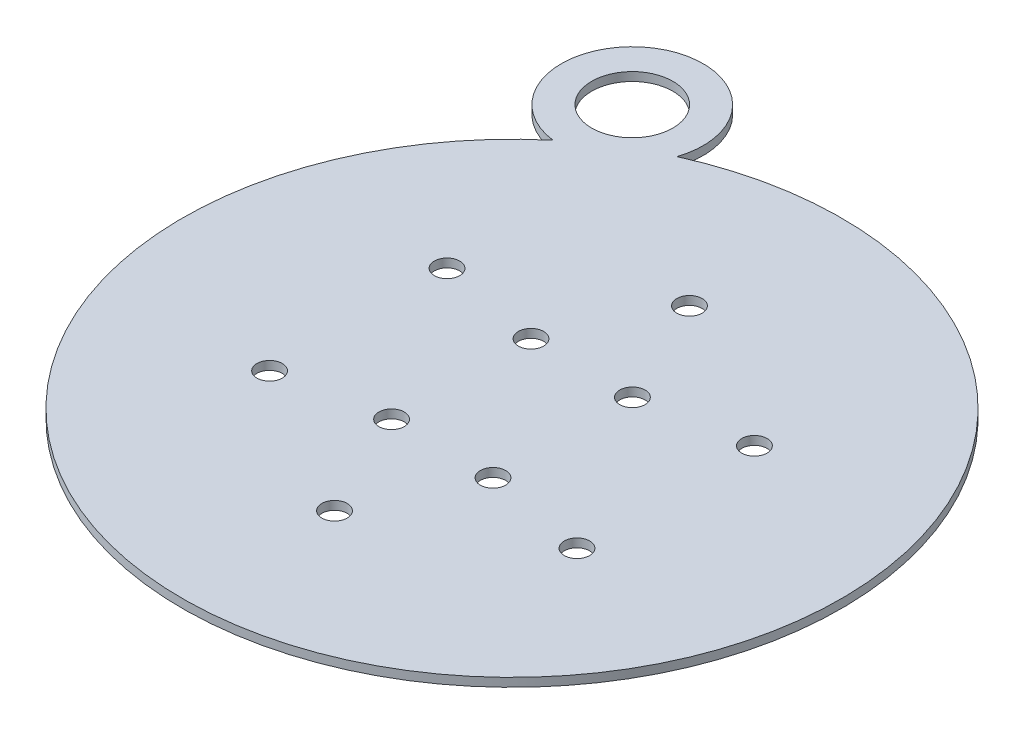
ISO-10303-21;
HEADER;
FILE_DESCRIPTION(('STEP AP214'),'2;1');
FILE_NAME('part.step','',(''),(''),'','','');
FILE_SCHEMA(('AUTOMOTIVE_DESIGN { 1 0 10303 214 1 1 1 1 }'));
ENDSEC;
DATA;
#1=APPLICATION_CONTEXT('core data for automotive mechanical design processes');
#2=APPLICATION_PROTOCOL_DEFINITION('international standard','automotive_design',2000,#1);
#3=PRODUCT_CONTEXT('',#1,'mechanical');
#4=PRODUCT('Part','Part','',(#3));
#5=PRODUCT_RELATED_PRODUCT_CATEGORY('part','',(#4));
#6=PRODUCT_DEFINITION_FORMATION('','',#4);
#7=PRODUCT_DEFINITION_CONTEXT('part definition',#1,'design');
#8=PRODUCT_DEFINITION('design','',#6,#7);
#9=PRODUCT_DEFINITION_SHAPE('','',#8);
#10=(LENGTH_UNIT() NAMED_UNIT(*) SI_UNIT(.MILLI.,.METRE.));
#11=(NAMED_UNIT(*) PLANE_ANGLE_UNIT() SI_UNIT($,.RADIAN.));
#12=(NAMED_UNIT(*) SI_UNIT($,.STERADIAN.) SOLID_ANGLE_UNIT());
#13=UNCERTAINTY_MEASURE_WITH_UNIT(LENGTH_MEASURE(1.E-05),#10,'distance_accuracy_value','');
#14=(GEOMETRIC_REPRESENTATION_CONTEXT(3) GLOBAL_UNCERTAINTY_ASSIGNED_CONTEXT((#13)) GLOBAL_UNIT_ASSIGNED_CONTEXT((#10,
#11,#12)) REPRESENTATION_CONTEXT('',''));
#15=CARTESIAN_POINT('',(0.,0.,0.));
#16=DIRECTION('',(0.,0.,1.));
#17=DIRECTION('',(1.,0.,0.));
#18=AXIS2_PLACEMENT_3D('',#15,#16,#17);
#19=CARTESIAN_POINT('',(0.,1.7,0.));
#20=DIRECTION('',(0.,-1.,0.));
#21=DIRECTION('',(0.,0.,-1.));
#22=AXIS2_PLACEMENT_3D('',#19,#20,#21);
#23=CYLINDRICAL_SURFACE('',#22,65.);
#24=CARTESIAN_POINT('',(0.,0.,0.));
#25=DIRECTION('',(0.,1.,0.));
#26=DIRECTION('',(0.,0.,1.));
#27=AXIS2_PLACEMENT_3D('',#24,#25,#26);
#28=CIRCLE('',#27,65.);
#29=CARTESIAN_POINT('',(-41.7401975185518,0.,-49.8272607225431));
#30=VERTEX_POINT('',#29);
#31=CARTESIAN_POINT('',(-26.7329434391451,0.,-59.248204488233));
#32=VERTEX_POINT('',#31);
#33=EDGE_CURVE('E65',#30,#32,#28,.T.);
#34=ORIENTED_EDGE('',*,*,#33,.T.);
#35=DIRECTION('',(0.,-1.,0.));
#36=VECTOR('',#35,1.);
#37=CARTESIAN_POINT('',(-26.7329434391451,1.7,-59.248204488233));
#38=LINE('',#37,#36);
#39=CARTESIAN_POINT('',(-26.7329434391451,1.7,-59.248204488233));
#40=VERTEX_POINT('',#39);
#41=EDGE_CURVE('E11',#40,#32,#38,.T.);
#42=ORIENTED_EDGE('',*,*,#41,.F.);
#43=CARTESIAN_POINT('',(0.,1.7,0.));
#44=DIRECTION('',(0.,1.,0.));
#45=DIRECTION('',(0.,0.,1.));
#46=AXIS2_PLACEMENT_3D('',#43,#44,#45);
#47=CIRCLE('',#46,65.);
#48=CARTESIAN_POINT('',(-41.7401975185518,1.7,-49.8272607225431));
#49=VERTEX_POINT('',#48);
#50=EDGE_CURVE('E68',#49,#40,#47,.T.);
#51=ORIENTED_EDGE('',*,*,#50,.F.);
#52=DIRECTION('',(0.,-1.,0.));
#53=VECTOR('',#52,1.);
#54=CARTESIAN_POINT('',(-41.7401975185518,1.7,-49.8272607225431));
#55=LINE('',#54,#53);
#56=EDGE_CURVE('E42',#49,#30,#55,.T.);
#57=ORIENTED_EDGE('',*,*,#56,.T.);
#58=EDGE_LOOP('',(#34,#42,#51,#57));
#59=FACE_BOUND('',#58,.T.);
#60=ADVANCED_FACE('F33',(#59),#23,.T.);
#61=CARTESIAN_POINT('',(-30.3108891324554,1.7,17.4999999999993));
#62=DIRECTION('',(0.,-1.,0.));
#63=DIRECTION('',(0.,0.,-1.));
#64=AXIS2_PLACEMENT_3D('',#61,#62,#63);
#65=CYLINDRICAL_SURFACE('',#64,2.49999999999982);
#66=CARTESIAN_POINT('',(-30.3108891324554,1.7,17.4999999999993));
#67=DIRECTION('',(0.,1.,0.));
#68=DIRECTION('',(0.,0.,1.));
#69=AXIS2_PLACEMENT_3D('',#66,#67,#68);
#70=CIRCLE('',#69,2.49999999999982);
#71=CARTESIAN_POINT('',(-30.3108891324554,1.7,19.9999999999991));
#72=VERTEX_POINT('',#71);
#73=EDGE_CURVE('E117',#72,#72,#70,.T.);
#74=ORIENTED_EDGE('',*,*,#73,.T.);
#75=EDGE_LOOP('',(#74));
#76=FACE_BOUND('',#75,.T.);
#77=CARTESIAN_POINT('',(-30.3108891324554,0.,17.4999999999993));
#78=DIRECTION('',(0.,1.,0.));
#79=DIRECTION('',(0.,0.,1.));
#80=AXIS2_PLACEMENT_3D('',#77,#78,#79);
#81=CIRCLE('',#80,2.49999999999982);
#82=CARTESIAN_POINT('',(-30.3108891324554,0.,19.9999999999991));
#83=VERTEX_POINT('',#82);
#84=EDGE_CURVE('E64',#83,#83,#81,.T.);
#85=ORIENTED_EDGE('',*,*,#84,.F.);
#86=EDGE_LOOP('',(#85));
#87=FACE_BOUND('',#86,.T.);
#88=ADVANCED_FACE('F163',(#76,#87),#65,.F.);
#89=CARTESIAN_POINT('',(-40.,1.7,-63.7186865887537));
#90=DIRECTION('',(0.,-1.,0.));
#91=DIRECTION('',(0.,0.,-1.));
#92=AXIS2_PLACEMENT_3D('',#89,#90,#91);
#93=CYLINDRICAL_SURFACE('',#92,14.);
#94=CARTESIAN_POINT('',(-40.,0.,-63.7186865887537));
#95=DIRECTION('',(0.,1.,0.));
#96=DIRECTION('',(0.,0.,1.));
#97=AXIS2_PLACEMENT_3D('',#94,#95,#96);
#98=CIRCLE('',#97,14.);
#99=EDGE_CURVE('E57',#32,#30,#98,.T.);
#100=ORIENTED_EDGE('',*,*,#99,.T.);
#101=ORIENTED_EDGE('',*,*,#56,.F.);
#102=CARTESIAN_POINT('',(-40.,1.7,-63.7186865887537));
#103=DIRECTION('',(0.,1.,0.));
#104=DIRECTION('',(0.,0.,1.));
#105=AXIS2_PLACEMENT_3D('',#102,#103,#104);
#106=CIRCLE('',#105,14.);
#107=EDGE_CURVE('E49',#40,#49,#106,.T.);
#108=ORIENTED_EDGE('',*,*,#107,.F.);
#109=ORIENTED_EDGE('',*,*,#41,.T.);
#110=EDGE_LOOP('',(#100,#101,#108,#109));
#111=FACE_BOUND('',#110,.T.);
#112=ADVANCED_FACE('F60',(#111),#93,.T.);
#113=CARTESIAN_POINT('',(-40.,1.7,-63.7186865887537));
#114=DIRECTION('',(0.,-1.,0.));
#115=DIRECTION('',(0.,0.,-1.));
#116=AXIS2_PLACEMENT_3D('',#113,#114,#115);
#117=CYLINDRICAL_SURFACE('',#116,8.);
#118=CARTESIAN_POINT('',(-40.,1.7,-63.7186865887537));
#119=DIRECTION('',(0.,1.,0.));
#120=DIRECTION('',(0.,0.,1.));
#121=AXIS2_PLACEMENT_3D('',#118,#119,#120);
#122=CIRCLE('',#121,8.);
#123=CARTESIAN_POINT('',(-40.,1.7,-55.7186865887537));
#124=VERTEX_POINT('',#123);
#125=EDGE_CURVE('E112',#124,#124,#122,.T.);
#126=ORIENTED_EDGE('',*,*,#125,.T.);
#127=EDGE_LOOP('',(#126));
#128=FACE_BOUND('',#127,.T.);
#129=CARTESIAN_POINT('',(-40.,0.,-63.7186865887537));
#130=DIRECTION('',(0.,1.,0.));
#131=DIRECTION('',(0.,0.,1.));
#132=AXIS2_PLACEMENT_3D('',#129,#130,#131);
#133=CIRCLE('',#132,8.);
#134=CARTESIAN_POINT('',(-40.,0.,-55.7186865887537));
#135=VERTEX_POINT('',#134);
#136=EDGE_CURVE('E72',#135,#135,#133,.T.);
#137=ORIENTED_EDGE('',*,*,#136,.F.);
#138=EDGE_LOOP('',(#137));
#139=FACE_BOUND('',#138,.T.);
#140=ADVANCED_FACE('F150',(#128,#139),#117,.F.);
#141=CARTESIAN_POINT('',(-4.26593399068118E-13,1.7,34.9999999999993));
#142=DIRECTION('',(0.,-1.,0.));
#143=DIRECTION('',(0.,0.,-1.));
#144=AXIS2_PLACEMENT_3D('',#141,#142,#143);
#145=CYLINDRICAL_SURFACE('',#144,2.50000000000004);
#146=CARTESIAN_POINT('',(-4.26593399068118E-13,1.7,34.9999999999993));
#147=DIRECTION('',(0.,1.,0.));
#148=DIRECTION('',(0.,0.,1.));
#149=AXIS2_PLACEMENT_3D('',#146,#147,#148);
#150=CIRCLE('',#149,2.50000000000004);
#151=CARTESIAN_POINT('',(-4.26593399068118E-13,1.7,37.4999999999993));
#152=VERTEX_POINT('',#151);
#153=EDGE_CURVE('E109',#152,#152,#150,.T.);
#154=ORIENTED_EDGE('',*,*,#153,.T.);
#155=EDGE_LOOP('',(#154));
#156=FACE_BOUND('',#155,.T.);
#157=CARTESIAN_POINT('',(-4.26593399068118E-13,0.,34.9999999999993));
#158=DIRECTION('',(0.,1.,0.));
#159=DIRECTION('',(0.,0.,1.));
#160=AXIS2_PLACEMENT_3D('',#157,#158,#159);
#161=CIRCLE('',#160,2.50000000000004);
#162=CARTESIAN_POINT('',(-4.26593399068118E-13,0.,37.4999999999993));
#163=VERTEX_POINT('',#162);
#164=EDGE_CURVE('E75',#163,#163,#161,.T.);
#165=ORIENTED_EDGE('',*,*,#164,.F.);
#166=EDGE_LOOP('',(#165));
#167=FACE_BOUND('',#166,.T.);
#168=ADVANCED_FACE('F147',(#156,#167),#145,.F.);
#169=CARTESIAN_POINT('',(30.3108891324547,1.7,17.4999999999996));
#170=DIRECTION('',(0.,-1.,0.));
#171=DIRECTION('',(0.,0.,-1.));
#172=AXIS2_PLACEMENT_3D('',#169,#170,#171);
#173=CYLINDRICAL_SURFACE('',#172,2.50000000000037);
#174=CARTESIAN_POINT('',(30.3108891324547,1.7,17.4999999999996));
#175=DIRECTION('',(0.,1.,0.));
#176=DIRECTION('',(0.,0.,1.));
#177=AXIS2_PLACEMENT_3D('',#174,#175,#176);
#178=CIRCLE('',#177,2.50000000000037);
#179=CARTESIAN_POINT('',(30.3108891324547,1.7,20.));
#180=VERTEX_POINT('',#179);
#181=EDGE_CURVE('E106',#180,#180,#178,.T.);
#182=ORIENTED_EDGE('',*,*,#181,.T.);
#183=EDGE_LOOP('',(#182));
#184=FACE_BOUND('',#183,.T.);
#185=CARTESIAN_POINT('',(30.3108891324547,0.,17.4999999999996));
#186=DIRECTION('',(0.,1.,0.));
#187=DIRECTION('',(0.,0.,1.));
#188=AXIS2_PLACEMENT_3D('',#185,#186,#187);
#189=CIRCLE('',#188,2.50000000000037);
#190=CARTESIAN_POINT('',(30.3108891324547,0.,20.));
#191=VERTEX_POINT('',#190);
#192=EDGE_CURVE('E140',#191,#191,#189,.T.);
#193=ORIENTED_EDGE('',*,*,#192,.F.);
#194=EDGE_LOOP('',(#193));
#195=FACE_BOUND('',#194,.T.);
#196=ADVANCED_FACE('F149',(#184,#195),#173,.F.);
#197=CARTESIAN_POINT('',(30.3108891324554,1.7,-17.4999999999999));
#198=DIRECTION('',(0.,-1.,0.));
#199=DIRECTION('',(0.,0.,-1.));
#200=AXIS2_PLACEMENT_3D('',#197,#198,#199);
#201=CYLINDRICAL_SURFACE('',#200,2.5);
#202=CARTESIAN_POINT('',(30.3108891324554,1.7,-17.4999999999999));
#203=DIRECTION('',(0.,1.,0.));
#204=DIRECTION('',(0.,0.,1.));
#205=AXIS2_PLACEMENT_3D('',#202,#203,#204);
#206=CIRCLE('',#205,2.5);
#207=CARTESIAN_POINT('',(30.3108891324554,1.7,-14.9999999999999));
#208=VERTEX_POINT('',#207);
#209=EDGE_CURVE('E103',#208,#208,#206,.T.);
#210=ORIENTED_EDGE('',*,*,#209,.T.);
#211=EDGE_LOOP('',(#210));
#212=FACE_BOUND('',#211,.T.);
#213=CARTESIAN_POINT('',(30.3108891324554,0.,-17.4999999999999));
#214=DIRECTION('',(0.,1.,0.));
#215=DIRECTION('',(0.,0.,1.));
#216=AXIS2_PLACEMENT_3D('',#213,#214,#215);
#217=CIRCLE('',#216,2.5);
#218=CARTESIAN_POINT('',(30.3108891324554,0.,-14.9999999999999));
#219=VERTEX_POINT('',#218);
#220=EDGE_CURVE('E137',#219,#219,#217,.T.);
#221=ORIENTED_EDGE('',*,*,#220,.F.);
#222=EDGE_LOOP('',(#221));
#223=FACE_BOUND('',#222,.T.);
#224=ADVANCED_FACE('F157',(#212,#223),#201,.F.);
#225=CARTESIAN_POINT('',(0.,1.7,-35.));
#226=DIRECTION('',(0.,-1.,0.));
#227=DIRECTION('',(0.,0.,-1.));
#228=AXIS2_PLACEMENT_3D('',#225,#226,#227);
#229=CYLINDRICAL_SURFACE('',#228,2.5);
#230=CARTESIAN_POINT('',(0.,1.7,-35.));
#231=DIRECTION('',(0.,1.,0.));
#232=DIRECTION('',(0.,0.,1.));
#233=AXIS2_PLACEMENT_3D('',#230,#231,#232);
#234=CIRCLE('',#233,2.5);
#235=CARTESIAN_POINT('',(0.,1.7,-32.5));
#236=VERTEX_POINT('',#235);
#237=EDGE_CURVE('E100',#236,#236,#234,.T.);
#238=ORIENTED_EDGE('',*,*,#237,.T.);
#239=EDGE_LOOP('',(#238));
#240=FACE_BOUND('',#239,.T.);
#241=CARTESIAN_POINT('',(0.,0.,-35.));
#242=DIRECTION('',(0.,1.,0.));
#243=DIRECTION('',(0.,0.,1.));
#244=AXIS2_PLACEMENT_3D('',#241,#242,#243);
#245=CIRCLE('',#244,2.5);
#246=CARTESIAN_POINT('',(0.,0.,-32.5));
#247=VERTEX_POINT('',#246);
#248=EDGE_CURVE('E134',#247,#247,#245,.T.);
#249=ORIENTED_EDGE('',*,*,#248,.F.);
#250=EDGE_LOOP('',(#249));
#251=FACE_BOUND('',#250,.T.);
#252=ADVANCED_FACE('F216',(#240,#251),#229,.F.);
#253=CARTESIAN_POINT('',(-30.3108891324552,1.7,-17.5000000000004));
#254=DIRECTION('',(0.,-1.,0.));
#255=DIRECTION('',(0.,0.,-1.));
#256=AXIS2_PLACEMENT_3D('',#253,#254,#255);
#257=CYLINDRICAL_SURFACE('',#256,2.5);
#258=CARTESIAN_POINT('',(-30.3108891324552,1.7,-17.5000000000004));
#259=DIRECTION('',(0.,1.,0.));
#260=DIRECTION('',(0.,0.,1.));
#261=AXIS2_PLACEMENT_3D('',#258,#259,#260);
#262=CIRCLE('',#261,2.5);
#263=CARTESIAN_POINT('',(-30.3108891324552,1.7,-15.0000000000004));
#264=VERTEX_POINT('',#263);
#265=EDGE_CURVE('E97',#264,#264,#262,.T.);
#266=ORIENTED_EDGE('',*,*,#265,.T.);
#267=EDGE_LOOP('',(#266));
#268=FACE_BOUND('',#267,.T.);
#269=CARTESIAN_POINT('',(-30.3108891324552,0.,-17.5000000000004));
#270=DIRECTION('',(0.,1.,0.));
#271=DIRECTION('',(0.,0.,1.));
#272=AXIS2_PLACEMENT_3D('',#269,#270,#271);
#273=CIRCLE('',#272,2.5);
#274=CARTESIAN_POINT('',(-30.3108891324552,0.,-15.0000000000004));
#275=VERTEX_POINT('',#274);
#276=EDGE_CURVE('E131',#275,#275,#273,.T.);
#277=ORIENTED_EDGE('',*,*,#276,.F.);
#278=EDGE_LOOP('',(#277));
#279=FACE_BOUND('',#278,.T.);
#280=ADVANCED_FACE('F223',(#268,#279),#257,.F.);
#281=CARTESIAN_POINT('',(10.,1.7,13.75));
#282=DIRECTION('',(0.,-1.,0.));
#283=DIRECTION('',(0.,0.,-1.));
#284=AXIS2_PLACEMENT_3D('',#281,#282,#283);
#285=CYLINDRICAL_SURFACE('',#284,2.5);
#286=CARTESIAN_POINT('',(10.,1.7,13.75));
#287=DIRECTION('',(0.,1.,0.));
#288=DIRECTION('',(0.,0.,1.));
#289=AXIS2_PLACEMENT_3D('',#286,#287,#288);
#290=CIRCLE('',#289,2.5);
#291=CARTESIAN_POINT('',(10.,1.7,16.25));
#292=VERTEX_POINT('',#291);
#293=EDGE_CURVE('E92',#292,#292,#290,.T.);
#294=ORIENTED_EDGE('',*,*,#293,.T.);
#295=EDGE_LOOP('',(#294));
#296=FACE_BOUND('',#295,.T.);
#297=CARTESIAN_POINT('',(10.,0.,13.75));
#298=DIRECTION('',(0.,1.,0.));
#299=DIRECTION('',(0.,0.,1.));
#300=AXIS2_PLACEMENT_3D('',#297,#298,#299);
#301=CIRCLE('',#300,2.5);
#302=CARTESIAN_POINT('',(10.,0.,16.25));
#303=VERTEX_POINT('',#302);
#304=EDGE_CURVE('E128',#303,#303,#301,.T.);
#305=ORIENTED_EDGE('',*,*,#304,.F.);
#306=EDGE_LOOP('',(#305));
#307=FACE_BOUND('',#306,.T.);
#308=ADVANCED_FACE('F229',(#296,#307),#285,.F.);
#309=CARTESIAN_POINT('',(10.,1.7,-13.75));
#310=DIRECTION('',(0.,-1.,0.));
#311=DIRECTION('',(0.,0.,-1.));
#312=AXIS2_PLACEMENT_3D('',#309,#310,#311);
#313=CYLINDRICAL_SURFACE('',#312,2.5);
#314=CARTESIAN_POINT('',(10.,1.7,-13.75));
#315=DIRECTION('',(0.,1.,0.));
#316=DIRECTION('',(0.,0.,1.));
#317=AXIS2_PLACEMENT_3D('',#314,#315,#316);
#318=CIRCLE('',#317,2.5);
#319=CARTESIAN_POINT('',(10.,1.7,-11.25));
#320=VERTEX_POINT('',#319);
#321=EDGE_CURVE('E87',#320,#320,#318,.T.);
#322=ORIENTED_EDGE('',*,*,#321,.T.);
#323=EDGE_LOOP('',(#322));
#324=FACE_BOUND('',#323,.T.);
#325=CARTESIAN_POINT('',(10.,0.,-13.75));
#326=DIRECTION('',(0.,1.,0.));
#327=DIRECTION('',(0.,0.,1.));
#328=AXIS2_PLACEMENT_3D('',#325,#326,#327);
#329=CIRCLE('',#328,2.5);
#330=CARTESIAN_POINT('',(10.,0.,-11.25));
#331=VERTEX_POINT('',#330);
#332=EDGE_CURVE('E125',#331,#331,#329,.T.);
#333=ORIENTED_EDGE('',*,*,#332,.F.);
#334=EDGE_LOOP('',(#333));
#335=FACE_BOUND('',#334,.T.);
#336=ADVANCED_FACE('F232',(#324,#335),#313,.F.);
#337=CARTESIAN_POINT('',(-10.,1.7,13.75));
#338=DIRECTION('',(0.,-1.,0.));
#339=DIRECTION('',(0.,0.,-1.));
#340=AXIS2_PLACEMENT_3D('',#337,#338,#339);
#341=CYLINDRICAL_SURFACE('',#340,2.5);
#342=CARTESIAN_POINT('',(-10.,1.7,13.75));
#343=DIRECTION('',(0.,1.,0.));
#344=DIRECTION('',(0.,0.,1.));
#345=AXIS2_PLACEMENT_3D('',#342,#343,#344);
#346=CIRCLE('',#345,2.5);
#347=CARTESIAN_POINT('',(-10.,1.7,16.25));
#348=VERTEX_POINT('',#347);
#349=EDGE_CURVE('E83',#348,#348,#346,.T.);
#350=ORIENTED_EDGE('',*,*,#349,.T.);
#351=EDGE_LOOP('',(#350));
#352=FACE_BOUND('',#351,.T.);
#353=CARTESIAN_POINT('',(-10.,0.,13.75));
#354=DIRECTION('',(0.,1.,0.));
#355=DIRECTION('',(0.,0.,1.));
#356=AXIS2_PLACEMENT_3D('',#353,#354,#355);
#357=CIRCLE('',#356,2.5);
#358=CARTESIAN_POINT('',(-10.,0.,16.25));
#359=VERTEX_POINT('',#358);
#360=EDGE_CURVE('E122',#359,#359,#357,.T.);
#361=ORIENTED_EDGE('',*,*,#360,.F.);
#362=EDGE_LOOP('',(#361));
#363=FACE_BOUND('',#362,.T.);
#364=ADVANCED_FACE('F35',(#352,#363),#341,.F.);
#365=CARTESIAN_POINT('',(-10.,1.7,-13.75));
#366=DIRECTION('',(0.,-1.,0.));
#367=DIRECTION('',(0.,0.,-1.));
#368=AXIS2_PLACEMENT_3D('',#365,#366,#367);
#369=CYLINDRICAL_SURFACE('',#368,2.5);
#370=CARTESIAN_POINT('',(-10.,1.7,-13.75));
#371=DIRECTION('',(0.,1.,0.));
#372=DIRECTION('',(0.,0.,1.));
#373=AXIS2_PLACEMENT_3D('',#370,#371,#372);
#374=CIRCLE('',#373,2.5);
#375=CARTESIAN_POINT('',(-10.,1.7,-11.25));
#376=VERTEX_POINT('',#375);
#377=EDGE_CURVE('E69',#376,#376,#374,.T.);
#378=ORIENTED_EDGE('',*,*,#377,.T.);
#379=EDGE_LOOP('',(#378));
#380=FACE_BOUND('',#379,.T.);
#381=CARTESIAN_POINT('',(-10.,0.,-13.75));
#382=DIRECTION('',(0.,1.,0.));
#383=DIRECTION('',(0.,0.,1.));
#384=AXIS2_PLACEMENT_3D('',#381,#382,#383);
#385=CIRCLE('',#384,2.5);
#386=CARTESIAN_POINT('',(-10.,0.,-11.25));
#387=VERTEX_POINT('',#386);
#388=EDGE_CURVE('E81',#387,#387,#385,.T.);
#389=ORIENTED_EDGE('',*,*,#388,.F.);
#390=EDGE_LOOP('',(#389));
#391=FACE_BOUND('',#390,.T.);
#392=ADVANCED_FACE('F173',(#380,#391),#369,.F.);
#393=CARTESIAN_POINT('',(0.,1.7,0.));
#394=DIRECTION('',(0.,1.,0.));
#395=DIRECTION('',(0.,0.,1.));
#396=AXIS2_PLACEMENT_3D('',#393,#394,#395);
#397=PLANE('',#396);
#398=ORIENTED_EDGE('',*,*,#349,.F.);
#399=EDGE_LOOP('',(#398));
#400=FACE_BOUND('',#399,.T.);
#401=ORIENTED_EDGE('',*,*,#321,.F.);
#402=EDGE_LOOP('',(#401));
#403=FACE_BOUND('',#402,.T.);
#404=ORIENTED_EDGE('',*,*,#293,.F.);
#405=EDGE_LOOP('',(#404));
#406=FACE_BOUND('',#405,.T.);
#407=ORIENTED_EDGE('',*,*,#265,.F.);
#408=EDGE_LOOP('',(#407));
#409=FACE_BOUND('',#408,.T.);
#410=ORIENTED_EDGE('',*,*,#237,.F.);
#411=EDGE_LOOP('',(#410));
#412=FACE_BOUND('',#411,.T.);
#413=ORIENTED_EDGE('',*,*,#209,.F.);
#414=EDGE_LOOP('',(#413));
#415=FACE_BOUND('',#414,.T.);
#416=ORIENTED_EDGE('',*,*,#181,.F.);
#417=EDGE_LOOP('',(#416));
#418=FACE_BOUND('',#417,.T.);
#419=ORIENTED_EDGE('',*,*,#153,.F.);
#420=EDGE_LOOP('',(#419));
#421=FACE_BOUND('',#420,.T.);
#422=ORIENTED_EDGE('',*,*,#125,.F.);
#423=EDGE_LOOP('',(#422));
#424=FACE_BOUND('',#423,.T.);
#425=ORIENTED_EDGE('',*,*,#50,.T.);
#426=ORIENTED_EDGE('',*,*,#107,.T.);
#427=EDGE_LOOP('',(#425,#426));
#428=FACE_BOUND('',#427,.T.);
#429=ORIENTED_EDGE('',*,*,#73,.F.);
#430=EDGE_LOOP('',(#429));
#431=FACE_BOUND('',#430,.T.);
#432=ORIENTED_EDGE('',*,*,#377,.F.);
#433=EDGE_LOOP('',(#432));
#434=FACE_BOUND('',#433,.T.);
#435=ADVANCED_FACE('F176',(#400,#403,#406,#409,#412,#415,#418,#421,#424,#428,#431,#434),#397,.T.);
#436=CARTESIAN_POINT('',(0.,0.,0.));
#437=DIRECTION('',(0.,1.,0.));
#438=DIRECTION('',(0.,0.,1.));
#439=AXIS2_PLACEMENT_3D('',#436,#437,#438);
#440=PLANE('',#439);
#441=ORIENTED_EDGE('',*,*,#360,.T.);
#442=EDGE_LOOP('',(#441));
#443=FACE_BOUND('',#442,.T.);
#444=ORIENTED_EDGE('',*,*,#332,.T.);
#445=EDGE_LOOP('',(#444));
#446=FACE_BOUND('',#445,.T.);
#447=ORIENTED_EDGE('',*,*,#304,.T.);
#448=EDGE_LOOP('',(#447));
#449=FACE_BOUND('',#448,.T.);
#450=ORIENTED_EDGE('',*,*,#276,.T.);
#451=EDGE_LOOP('',(#450));
#452=FACE_BOUND('',#451,.T.);
#453=ORIENTED_EDGE('',*,*,#248,.T.);
#454=EDGE_LOOP('',(#453));
#455=FACE_BOUND('',#454,.T.);
#456=ORIENTED_EDGE('',*,*,#220,.T.);
#457=EDGE_LOOP('',(#456));
#458=FACE_BOUND('',#457,.T.);
#459=ORIENTED_EDGE('',*,*,#192,.T.);
#460=EDGE_LOOP('',(#459));
#461=FACE_BOUND('',#460,.T.);
#462=ORIENTED_EDGE('',*,*,#164,.T.);
#463=EDGE_LOOP('',(#462));
#464=FACE_BOUND('',#463,.T.);
#465=ORIENTED_EDGE('',*,*,#136,.T.);
#466=EDGE_LOOP('',(#465));
#467=FACE_BOUND('',#466,.T.);
#468=ORIENTED_EDGE('',*,*,#33,.F.);
#469=ORIENTED_EDGE('',*,*,#99,.F.);
#470=EDGE_LOOP('',(#468,#469));
#471=FACE_BOUND('',#470,.T.);
#472=ORIENTED_EDGE('',*,*,#84,.T.);
#473=EDGE_LOOP('',(#472));
#474=FACE_BOUND('',#473,.T.);
#475=ORIENTED_EDGE('',*,*,#388,.T.);
#476=EDGE_LOOP('',(#475));
#477=FACE_BOUND('',#476,.T.);
#478=ADVANCED_FACE('F70',(#443,#446,#449,#452,#455,#458,#461,#464,#467,#471,#474,#477),#440,.F.);
#479=CLOSED_SHELL('',(#60,#88,#112,#140,#168,#196,#224,#252,#280,#308,#336,#364,#392,#435,#478));
#480=MANIFOLD_SOLID_BREP('B2',#479);
#481=ADVANCED_BREP_SHAPE_REPRESENTATION('',(#18,#480),#14);
#482=SHAPE_DEFINITION_REPRESENTATION(#9,#481);
ENDSEC;
END-ISO-10303-21;
